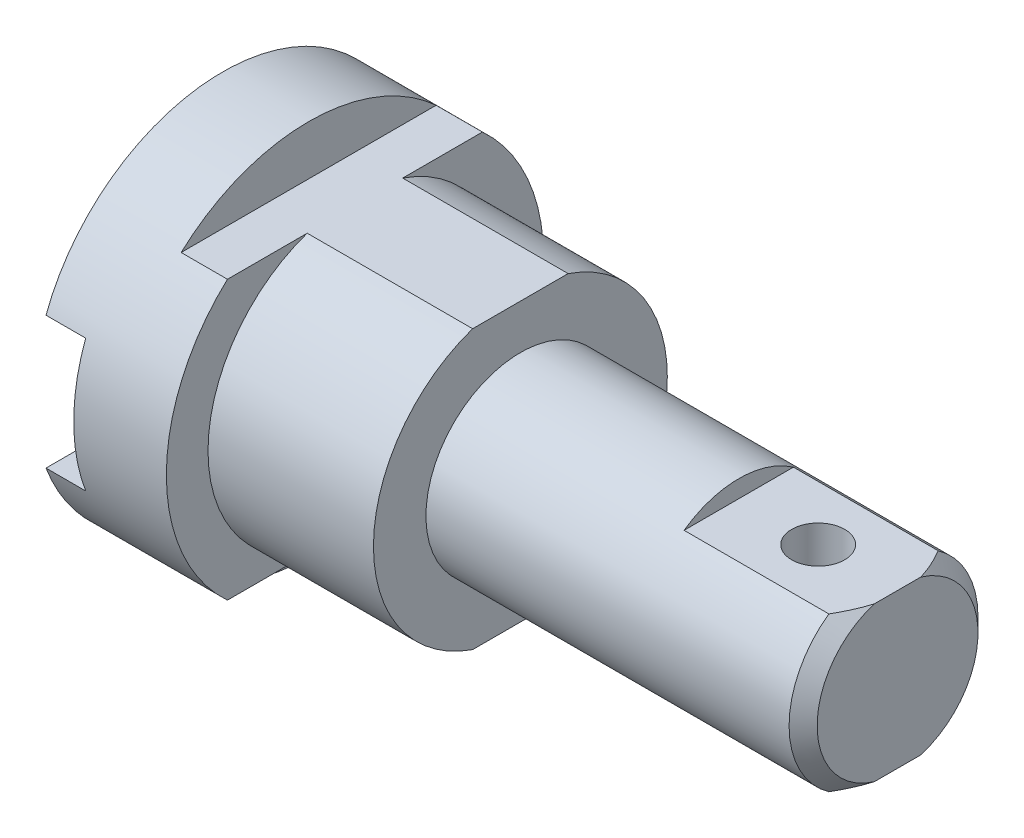
ISO-10303-21;
HEADER;
FILE_DESCRIPTION(('STEP AP214'),'2;1');
FILE_NAME('part.step','',(''),(''),'','','');
FILE_SCHEMA(('AUTOMOTIVE_DESIGN { 1 0 10303 214 1 1 1 1 }'));
ENDSEC;
DATA;
#1=APPLICATION_CONTEXT('core data for automotive mechanical design processes');
#2=APPLICATION_PROTOCOL_DEFINITION('international standard','automotive_design',2000,#1);
#3=PRODUCT_CONTEXT('',#1,'mechanical');
#4=PRODUCT('Part','Part','',(#3));
#5=PRODUCT_RELATED_PRODUCT_CATEGORY('part','',(#4));
#6=PRODUCT_DEFINITION_FORMATION('','',#4);
#7=PRODUCT_DEFINITION_CONTEXT('part definition',#1,'design');
#8=PRODUCT_DEFINITION('design','',#6,#7);
#9=PRODUCT_DEFINITION_SHAPE('','',#8);
#10=(LENGTH_UNIT() NAMED_UNIT(*) SI_UNIT(.MILLI.,.METRE.));
#11=(NAMED_UNIT(*) PLANE_ANGLE_UNIT() SI_UNIT($,.RADIAN.));
#12=(NAMED_UNIT(*) SI_UNIT($,.STERADIAN.) SOLID_ANGLE_UNIT());
#13=UNCERTAINTY_MEASURE_WITH_UNIT(LENGTH_MEASURE(1.E-05),#10,'distance_accuracy_value','');
#14=(GEOMETRIC_REPRESENTATION_CONTEXT(3) GLOBAL_UNCERTAINTY_ASSIGNED_CONTEXT((#13)) GLOBAL_UNIT_ASSIGNED_CONTEXT((#10,
#11,#12)) REPRESENTATION_CONTEXT('',''));
#15=CARTESIAN_POINT('',(0.,0.,0.));
#16=DIRECTION('',(0.,0.,1.));
#17=DIRECTION('',(1.,0.,0.));
#18=AXIS2_PLACEMENT_3D('',#15,#16,#17);
#19=CARTESIAN_POINT('',(0.,28.5,0.));
#20=DIRECTION('',(-1.,0.,0.));
#21=DIRECTION('',(0.,-1.,0.));
#22=AXIS2_PLACEMENT_3D('',#19,#20,#21);
#23=CYLINDRICAL_SURFACE('',#22,28.5);
#24=CARTESIAN_POINT('',(6.,28.5,0.));
#25=DIRECTION('',(-1.,0.,0.));
#26=DIRECTION('',(0.,0.,1.));
#27=AXIS2_PLACEMENT_3D('',#24,#25,#26);
#28=CIRCLE('',#27,28.5);
#29=CARTESIAN_POINT('',(6.,38.5,26.688012290165));
#30=VERTEX_POINT('',#29);
#31=CARTESIAN_POINT('',(6.,18.5,26.688012290165));
#32=VERTEX_POINT('',#31);
#33=EDGE_CURVE('E374',#30,#32,#28,.F.);
#34=ORIENTED_EDGE('',*,*,#33,.T.);
#35=DIRECTION('',(-1.,0.,0.));
#36=VECTOR('',#35,1.);
#37=CARTESIAN_POINT('',(0.,18.5,26.688012290165));
#38=LINE('',#37,#36);
#39=CARTESIAN_POINT('',(0.,18.5,26.688012290165));
#40=VERTEX_POINT('',#39);
#41=EDGE_CURVE('E389',#40,#32,#38,.F.);
#42=ORIENTED_EDGE('',*,*,#41,.F.);
#43=CARTESIAN_POINT('',(0.,28.5,0.));
#44=DIRECTION('',(-1.,0.,0.));
#45=DIRECTION('',(0.,-1.,0.));
#46=AXIS2_PLACEMENT_3D('',#43,#44,#45);
#47=CIRCLE('',#46,28.5);
#48=CARTESIAN_POINT('',(0.,18.5,-26.688012290165));
#49=VERTEX_POINT('',#48);
#50=EDGE_CURVE('E369',#49,#40,#47,.T.);
#51=ORIENTED_EDGE('',*,*,#50,.F.);
#52=DIRECTION('',(-1.,0.,0.));
#53=VECTOR('',#52,1.);
#54=CARTESIAN_POINT('',(0.,18.5,-26.688012290165));
#55=LINE('',#54,#53);
#56=CARTESIAN_POINT('',(6.,18.5,-26.688012290165));
#57=VERTEX_POINT('',#56);
#58=EDGE_CURVE('E386',#57,#49,#55,.T.);
#59=ORIENTED_EDGE('',*,*,#58,.F.);
#60=CARTESIAN_POINT('',(6.,38.5,-26.688012290165));
#61=VERTEX_POINT('',#60);
#62=EDGE_CURVE('E378',#57,#61,#28,.F.);
#63=ORIENTED_EDGE('',*,*,#62,.T.);
#64=DIRECTION('',(-1.,0.,0.));
#65=VECTOR('',#64,1.);
#66=CARTESIAN_POINT('',(0.,38.5,-26.688012290165));
#67=LINE('',#66,#65);
#68=CARTESIAN_POINT('',(0.,38.5,-26.688012290165));
#69=VERTEX_POINT('',#68);
#70=EDGE_CURVE('E382',#61,#69,#67,.T.);
#71=ORIENTED_EDGE('',*,*,#70,.T.);
#72=CARTESIAN_POINT('',(0.,38.5,26.688012290165));
#73=VERTEX_POINT('',#72);
#74=EDGE_CURVE('E373',#73,#69,#47,.T.);
#75=ORIENTED_EDGE('',*,*,#74,.F.);
#76=DIRECTION('',(-1.,0.,0.));
#77=VECTOR('',#76,1.);
#78=CARTESIAN_POINT('',(0.,38.5,26.688012290165));
#79=LINE('',#78,#77);
#80=EDGE_CURVE('E377',#73,#30,#79,.F.);
#81=ORIENTED_EDGE('',*,*,#80,.T.);
#82=EDGE_LOOP('',(#34,#42,#51,#59,#63,#71,#75,#81));
#83=FACE_BOUND('',#82,.T.);
#84=CARTESIAN_POINT('',(13.,28.5,0.));
#85=DIRECTION('',(1.,0.,0.));
#86=DIRECTION('',(0.,1.,0.));
#87=AXIS2_PLACEMENT_3D('',#84,#85,#86);
#88=CIRCLE('',#87,28.5);
#89=CARTESIAN_POINT('',(13.,7.49999999999999,19.2678488679977));
#90=VERTEX_POINT('',#89);
#91=CARTESIAN_POINT('',(13.,7.49999999999999,-19.2678488679977));
#92=VERTEX_POINT('',#91);
#93=EDGE_CURVE('E174',#90,#92,#88,.T.);
#94=ORIENTED_EDGE('',*,*,#93,.F.);
#95=DIRECTION('',(1.,0.,0.));
#96=VECTOR('',#95,1.);
#97=CARTESIAN_POINT('',(13.,7.49999999999999,19.2678488679977));
#98=LINE('',#97,#96);
#99=CARTESIAN_POINT('',(20.,7.49999999999999,19.2678488679977));
#100=VERTEX_POINT('',#99);
#101=EDGE_CURVE('E161',#90,#100,#98,.T.);
#102=ORIENTED_EDGE('',*,*,#101,.T.);
#103=CARTESIAN_POINT('',(20.,28.5,0.));
#104=DIRECTION('',(-1.,0.,0.));
#105=DIRECTION('',(0.,-1.,0.));
#106=AXIS2_PLACEMENT_3D('',#103,#104,#105);
#107=CIRCLE('',#106,28.5);
#108=CARTESIAN_POINT('',(20.,49.5,19.2678488679977));
#109=VERTEX_POINT('',#108);
#110=EDGE_CURVE('E366',#100,#109,#107,.T.);
#111=ORIENTED_EDGE('',*,*,#110,.T.);
#112=DIRECTION('',(-1.,0.,0.));
#113=VECTOR('',#112,1.);
#114=CARTESIAN_POINT('',(45.,49.5,19.2678488679977));
#115=LINE('',#114,#113);
#116=CARTESIAN_POINT('',(13.,49.5,19.2678488679977));
#117=VERTEX_POINT('',#116);
#118=EDGE_CURVE('E198',#109,#117,#115,.T.);
#119=ORIENTED_EDGE('',*,*,#118,.T.);
#120=CARTESIAN_POINT('',(13.,28.5,0.));
#121=DIRECTION('',(1.,0.,0.));
#122=DIRECTION('',(0.,1.,0.));
#123=AXIS2_PLACEMENT_3D('',#120,#121,#122);
#124=CIRCLE('',#123,28.5);
#125=CARTESIAN_POINT('',(13.,49.5,-19.2678488679977));
#126=VERTEX_POINT('',#125);
#127=EDGE_CURVE('E187',#126,#117,#124,.T.);
#128=ORIENTED_EDGE('',*,*,#127,.F.);
#129=DIRECTION('',(-1.,0.,0.));
#130=VECTOR('',#129,1.);
#131=CARTESIAN_POINT('',(45.,49.5,-19.2678488679977));
#132=LINE('',#131,#130);
#133=CARTESIAN_POINT('',(20.,49.5,-19.2678488679977));
#134=VERTEX_POINT('',#133);
#135=EDGE_CURVE('E195',#134,#126,#132,.T.);
#136=ORIENTED_EDGE('',*,*,#135,.F.);
#137=CARTESIAN_POINT('',(20.,7.49999999999999,-19.2678488679977));
#138=VERTEX_POINT('',#137);
#139=EDGE_CURVE('E365',#134,#138,#107,.T.);
#140=ORIENTED_EDGE('',*,*,#139,.T.);
#141=DIRECTION('',(1.,0.,0.));
#142=VECTOR('',#141,1.);
#143=CARTESIAN_POINT('',(13.,7.49999999999999,-19.2678488679977));
#144=LINE('',#143,#142);
#145=EDGE_CURVE('E173',#92,#138,#144,.T.);
#146=ORIENTED_EDGE('',*,*,#145,.F.);
#147=EDGE_LOOP('',(#94,#102,#111,#119,#128,#136,#140,#146));
#148=FACE_BOUND('',#147,.T.);
#149=ADVANCED_FACE('F38',(#83,#148),#23,.T.);
#150=CARTESIAN_POINT('',(20.,0.,0.));
#151=DIRECTION('',(1.,0.,0.));
#152=DIRECTION('',(0.,1.,0.));
#153=AXIS2_PLACEMENT_3D('',#150,#151,#152);
#154=PLANE('',#153);
#155=ORIENTED_EDGE('',*,*,#110,.F.);
#156=DIRECTION('',(0.,0.,-1.));
#157=VECTOR('',#156,1.);
#158=CARTESIAN_POINT('',(20.,7.49999999999999,0.));
#159=LINE('',#158,#157);
#160=CARTESIAN_POINT('',(20.,7.49999999999999,7.2154019292067));
#161=VERTEX_POINT('',#160);
#162=EDGE_CURVE('E167',#100,#161,#159,.T.);
#163=ORIENTED_EDGE('',*,*,#162,.T.);
#164=CARTESIAN_POINT('',(20.,28.5,0.));
#165=DIRECTION('',(-1.,0.,0.));
#166=DIRECTION('',(0.,-1.,0.));
#167=AXIS2_PLACEMENT_3D('',#164,#165,#166);
#168=CIRCLE('',#167,22.205);
#169=CARTESIAN_POINT('',(20.,49.5,7.21540192920668));
#170=VERTEX_POINT('',#169);
#171=EDGE_CURVE('E361',#161,#170,#168,.T.);
#172=ORIENTED_EDGE('',*,*,#171,.T.);
#173=DIRECTION('',(0.,0.,1.));
#174=VECTOR('',#173,1.);
#175=CARTESIAN_POINT('',(20.,49.5,0.));
#176=LINE('',#175,#174);
#177=EDGE_CURVE('E204',#170,#109,#176,.T.);
#178=ORIENTED_EDGE('',*,*,#177,.T.);
#179=EDGE_LOOP('',(#155,#163,#172,#178));
#180=FACE_BOUND('',#179,.T.);
#181=ADVANCED_FACE('F313',(#180),#154,.T.);
#182=CARTESIAN_POINT('',(20.,49.5,-7.21540192920668));
#183=VERTEX_POINT('',#182);
#184=CARTESIAN_POINT('',(20.,7.49999999999999,-7.2154019292067));
#185=VERTEX_POINT('',#184);
#186=EDGE_CURVE('E360',#183,#185,#168,.T.);
#187=ORIENTED_EDGE('',*,*,#186,.T.);
#188=EDGE_CURVE('E215',#185,#138,#159,.T.);
#189=ORIENTED_EDGE('',*,*,#188,.T.);
#190=ORIENTED_EDGE('',*,*,#139,.F.);
#191=EDGE_CURVE('E209',#134,#183,#176,.T.);
#192=ORIENTED_EDGE('',*,*,#191,.T.);
#193=EDGE_LOOP('',(#187,#189,#190,#192));
#194=FACE_BOUND('',#193,.T.);
#195=ADVANCED_FACE('F318',(#194),#154,.T.);
#196=CARTESIAN_POINT('',(0.,28.5,0.));
#197=DIRECTION('',(-1.,0.,0.));
#198=DIRECTION('',(0.,-1.,0.));
#199=AXIS2_PLACEMENT_3D('',#196,#197,#198);
#200=CYLINDRICAL_SURFACE('',#199,22.205);
#201=ORIENTED_EDGE('',*,*,#171,.F.);
#202=DIRECTION('',(-1.,0.,0.));
#203=VECTOR('',#202,1.);
#204=CARTESIAN_POINT('',(0.,7.49999999999999,7.2154019292067));
#205=LINE('',#204,#203);
#206=CARTESIAN_POINT('',(45.,7.49999999999999,7.21540192920669));
#207=VERTEX_POINT('',#206);
#208=EDGE_CURVE('E219',#161,#207,#205,.F.);
#209=ORIENTED_EDGE('',*,*,#208,.T.);
#210=CARTESIAN_POINT('',(45.,28.5,0.));
#211=DIRECTION('',(-1.,0.,0.));
#212=DIRECTION('',(0.,-1.,0.));
#213=AXIS2_PLACEMENT_3D('',#210,#211,#212);
#214=CIRCLE('',#213,22.205);
#215=CARTESIAN_POINT('',(45.,49.5,7.21540192920668));
#216=VERTEX_POINT('',#215);
#217=EDGE_CURVE('E352',#207,#216,#214,.T.);
#218=ORIENTED_EDGE('',*,*,#217,.T.);
#219=DIRECTION('',(-1.,0.,0.));
#220=VECTOR('',#219,1.);
#221=CARTESIAN_POINT('',(0.,49.5,7.21540192920668));
#222=LINE('',#221,#220);
#223=EDGE_CURVE('E61',#216,#170,#222,.T.);
#224=ORIENTED_EDGE('',*,*,#223,.T.);
#225=EDGE_LOOP('',(#201,#209,#218,#224));
#226=FACE_BOUND('',#225,.T.);
#227=ADVANCED_FACE('F322',(#226),#200,.T.);
#228=CARTESIAN_POINT('',(45.,49.5,-7.21540192920668));
#229=VERTEX_POINT('',#228);
#230=CARTESIAN_POINT('',(45.,7.49999999999999,-7.21540192920669));
#231=VERTEX_POINT('',#230);
#232=EDGE_CURVE('E345',#229,#231,#214,.T.);
#233=ORIENTED_EDGE('',*,*,#232,.T.);
#234=DIRECTION('',(-1.,0.,0.));
#235=VECTOR('',#234,1.);
#236=CARTESIAN_POINT('',(0.,7.49999999999999,-7.2154019292067));
#237=LINE('',#236,#235);
#238=EDGE_CURVE('E53',#231,#185,#237,.T.);
#239=ORIENTED_EDGE('',*,*,#238,.T.);
#240=ORIENTED_EDGE('',*,*,#186,.F.);
#241=DIRECTION('',(-1.,0.,0.));
#242=VECTOR('',#241,1.);
#243=CARTESIAN_POINT('',(0.,49.5,-7.21540192920668));
#244=LINE('',#243,#242);
#245=EDGE_CURVE('E208',#183,#229,#244,.F.);
#246=ORIENTED_EDGE('',*,*,#245,.T.);
#247=EDGE_LOOP('',(#233,#239,#240,#246));
#248=FACE_BOUND('',#247,.T.);
#249=ADVANCED_FACE('F325',(#248),#200,.T.);
#250=CARTESIAN_POINT('',(45.,0.,0.));
#251=DIRECTION('',(-1.,0.,0.));
#252=DIRECTION('',(0.,-1.,0.));
#253=AXIS2_PLACEMENT_3D('',#250,#251,#252);
#254=PLANE('',#253);
#255=CARTESIAN_POINT('',(45.,28.5,0.));
#256=DIRECTION('',(-1.,0.,0.));
#257=DIRECTION('',(0.,-1.,0.));
#258=AXIS2_PLACEMENT_3D('',#255,#256,#257);
#259=CIRCLE('',#258,14.275);
#260=CARTESIAN_POINT('',(45.,14.225,0.));
#261=VERTEX_POINT('',#260);
#262=EDGE_CURVE('E343',#261,#261,#259,.T.);
#263=ORIENTED_EDGE('',*,*,#262,.T.);
#264=EDGE_LOOP('',(#263));
#265=FACE_BOUND('',#264,.T.);
#266=DIRECTION('',(0.,0.,1.));
#267=VECTOR('',#266,1.);
#268=CARTESIAN_POINT('',(45.,7.49999999999999,0.));
#269=LINE('',#268,#267);
#270=EDGE_CURVE('E11',#231,#207,#269,.T.);
#271=ORIENTED_EDGE('',*,*,#270,.F.);
#272=ORIENTED_EDGE('',*,*,#232,.F.);
#273=DIRECTION('',(0.,0.,-1.));
#274=VECTOR('',#273,1.);
#275=CARTESIAN_POINT('',(45.,49.5,0.));
#276=LINE('',#275,#274);
#277=EDGE_CURVE('E47',#216,#229,#276,.T.);
#278=ORIENTED_EDGE('',*,*,#277,.F.);
#279=ORIENTED_EDGE('',*,*,#217,.F.);
#280=EDGE_LOOP('',(#271,#272,#278,#279));
#281=FACE_BOUND('',#280,.T.);
#282=ADVANCED_FACE('F327',(#265,#281),#254,.F.);
#283=CARTESIAN_POINT('',(0.,28.5,0.));
#284=DIRECTION('',(-1.,0.,0.));
#285=DIRECTION('',(0.,-1.,0.));
#286=AXIS2_PLACEMENT_3D('',#283,#284,#285);
#287=CYLINDRICAL_SURFACE('',#286,14.275);
#288=DIRECTION('',(1.,0.,0.));
#289=VECTOR('',#288,1.);
#290=CARTESIAN_POINT('',(78.,40.14,8.2635358654755));
#291=LINE('',#290,#289);
#292=CARTESIAN_POINT('',(78.,40.14,8.2635358654755));
#293=VERTEX_POINT('',#292);
#294=CARTESIAN_POINT('',(99.8786796564404,40.14,8.2635358654755));
#295=VERTEX_POINT('',#294);
#296=EDGE_CURVE('E242',#293,#295,#291,.T.);
#297=ORIENTED_EDGE('',*,*,#296,.F.);
#298=CARTESIAN_POINT('',(78.,28.5,0.));
#299=DIRECTION('',(1.,0.,0.));
#300=DIRECTION('',(0.,0.,-1.));
#301=AXIS2_PLACEMENT_3D('',#298,#299,#300);
#302=CIRCLE('',#301,14.275);
#303=CARTESIAN_POINT('',(78.,40.14,-8.2635358654755));
#304=VERTEX_POINT('',#303);
#305=EDGE_CURVE('E236',#304,#293,#302,.T.);
#306=ORIENTED_EDGE('',*,*,#305,.F.);
#307=DIRECTION('',(1.,0.,0.));
#308=VECTOR('',#307,1.);
#309=CARTESIAN_POINT('',(78.,40.14,-8.2635358654755));
#310=LINE('',#309,#308);
#311=CARTESIAN_POINT('',(99.8786796564404,40.14,-8.2635358654755));
#312=VERTEX_POINT('',#311);
#313=EDGE_CURVE('E241',#304,#312,#310,.T.);
#314=ORIENTED_EDGE('',*,*,#313,.T.);
#315=CARTESIAN_POINT('',(99.8786796564404,28.5,0.));
#316=DIRECTION('',(-1.,0.,0.));
#317=DIRECTION('',(0.,-1.,0.));
#318=AXIS2_PLACEMENT_3D('',#315,#316,#317);
#319=CIRCLE('',#318,14.275);
#320=CARTESIAN_POINT('',(99.8786796564404,16.86,-8.2635358654755));
#321=VERTEX_POINT('',#320);
#322=EDGE_CURVE('E354',#312,#321,#319,.T.);
#323=ORIENTED_EDGE('',*,*,#322,.T.);
#324=DIRECTION('',(1.,0.,0.));
#325=VECTOR('',#324,1.);
#326=CARTESIAN_POINT('',(78.,16.86,-8.2635358654755));
#327=LINE('',#326,#325);
#328=CARTESIAN_POINT('',(78.,16.86,-8.2635358654755));
#329=VERTEX_POINT('',#328);
#330=EDGE_CURVE('E237',#329,#321,#327,.T.);
#331=ORIENTED_EDGE('',*,*,#330,.F.);
#332=CARTESIAN_POINT('',(78.,28.5,0.));
#333=DIRECTION('',(1.,0.,0.));
#334=DIRECTION('',(0.,0.,-1.));
#335=AXIS2_PLACEMENT_3D('',#332,#333,#334);
#336=CIRCLE('',#335,14.275);
#337=CARTESIAN_POINT('',(78.,16.86,8.2635358654755));
#338=VERTEX_POINT('',#337);
#339=EDGE_CURVE('E251',#338,#329,#336,.T.);
#340=ORIENTED_EDGE('',*,*,#339,.F.);
#341=DIRECTION('',(1.,0.,0.));
#342=VECTOR('',#341,1.);
#343=CARTESIAN_POINT('',(78.,16.86,8.2635358654755));
#344=LINE('',#343,#342);
#345=CARTESIAN_POINT('',(99.8786796564404,16.86,8.2635358654755));
#346=VERTEX_POINT('',#345);
#347=EDGE_CURVE('E255',#338,#346,#344,.T.);
#348=ORIENTED_EDGE('',*,*,#347,.T.);
#349=EDGE_CURVE('E346',#346,#295,#319,.T.);
#350=ORIENTED_EDGE('',*,*,#349,.T.);
#351=EDGE_LOOP('',(#297,#306,#314,#323,#331,#340,#348,#350));
#352=FACE_BOUND('',#351,.T.);
#353=ORIENTED_EDGE('',*,*,#262,.F.);
#354=EDGE_LOOP('',(#353));
#355=FACE_BOUND('',#354,.T.);
#356=ADVANCED_FACE('F329',(#352,#355),#287,.T.);
#357=CARTESIAN_POINT('',(99.8786796564404,28.5,0.));
#358=DIRECTION('',(-1.,0.,0.));
#359=DIRECTION('',(0.,-1.,0.));
#360=AXIS2_PLACEMENT_3D('',#357,#358,#359);
#361=CONICAL_SURFACE('',#360,14.275,0.785398163397454);
#362=CARTESIAN_POINT('',(92.498062588906,40.14,18.2613293759159));
#363=CARTESIAN_POINT('',(92.7363226574536,40.14,17.9787688709205));
#364=CARTESIAN_POINT('',(92.9736643875376,40.14,17.6954304428129));
#365=CARTESIAN_POINT('',(93.446236530121,40.14,17.1269872047509));
#366=CARTESIAN_POINT('',(93.6814668910517,40.14,16.841882351939));
#367=CARTESIAN_POINT('',(94.1496747980146,40.14,16.2695324940389));
#368=CARTESIAN_POINT('',(94.382650860377,40.14,15.9822862741076));
#369=CARTESIAN_POINT('',(94.8458532936076,40.14,15.4055859145328));
#370=CARTESIAN_POINT('',(95.0760796775637,40.14,15.1161317854091));
#371=CARTESIAN_POINT('',(95.5421829378795,40.14,14.5235318144026));
#372=CARTESIAN_POINT('',(95.7779356581344,40.14,14.220288203307));
#373=CARTESIAN_POINT('',(96.2454689034429,40.14,13.6107551187639));
#374=CARTESIAN_POINT('',(96.4772494683969,40.14,13.3044656759607));
#375=CARTESIAN_POINT('',(96.9360953159255,40.14,12.6884920225647));
#376=CARTESIAN_POINT('',(97.1631617966741,40.14,12.3788087059366));
#377=CARTESIAN_POINT('',(97.611794154481,40.14,11.7554755223952));
#378=CARTESIAN_POINT('',(97.8333600332159,40.14,11.441825656691));
#379=CARTESIAN_POINT('',(98.2705743023471,40.14,10.8090660285851));
#380=CARTESIAN_POINT('',(98.4862035698018,40.14,10.489943020389));
#381=CARTESIAN_POINT('',(98.9095422664797,40.14,9.84646393188221));
#382=CARTESIAN_POINT('',(99.1172515810786,40.14,9.5221077759296));
#383=CARTESIAN_POINT('',(99.5232866514261,40.14,8.86707037649804));
#384=CARTESIAN_POINT('',(99.7216021131482,40.14,8.53638272747245));
#385=CARTESIAN_POINT('',(100.106480455398,40.14,7.86821430755542));
#386=CARTESIAN_POINT('',(100.293043621564,40.14,7.53073370202946));
#387=CARTESIAN_POINT('',(100.648904358937,40.14,6.85354099477498));
#388=CARTESIAN_POINT('',(100.818428292339,40.14,6.51394855756123));
#389=CARTESIAN_POINT('',(101.140342545527,40.14,5.82662333486554));
#390=CARTESIAN_POINT('',(101.292730725293,40.14,5.4788895391778));
#391=CARTESIAN_POINT('',(101.576210550916,40.14,4.77560766208542));
#392=CARTESIAN_POINT('',(101.707345993088,40.14,4.42007741003604));
#393=CARTESIAN_POINT('',(101.944256931558,40.14,3.70075525567693));
#394=CARTESIAN_POINT('',(102.050044668793,40.14,3.33696743441941));
#395=CARTESIAN_POINT('',(102.232892722163,40.14,2.5972103251297));
#396=CARTESIAN_POINT('',(102.3095703756,40.14,2.22114493668793));
#397=CARTESIAN_POINT('',(102.427998182631,40.14,1.46350379375055));
#398=CARTESIAN_POINT('',(102.469752655395,40.14,1.08192872661143));
#399=CARTESIAN_POINT('',(102.515583194606,40.14,0.317492505654497));
#400=CARTESIAN_POINT('',(102.519758659882,40.14,-0.0653625741706913));
#401=CARTESIAN_POINT('',(102.490403289775,40.14,-0.829626247042338));
#402=CARTESIAN_POINT('',(102.456869521945,40.14,-1.21103472527989));
#403=CARTESIAN_POINT('',(102.354899438839,40.14,-1.96455681975909));
#404=CARTESIAN_POINT('',(102.286872824525,40.14,-2.33672693803497));
#405=CARTESIAN_POINT('',(102.119974529391,40.14,-3.07400978974065));
#406=CARTESIAN_POINT('',(102.021099619263,40.14,-3.43912178004956));
#407=CARTESIAN_POINT('',(101.795608186654,40.14,-4.1657209635291));
#408=CARTESIAN_POINT('',(101.668652834269,40.14,-4.5271019717973));
#409=CARTESIAN_POINT('',(101.461486502576,40.14,-5.0625334185967));
#410=CARTESIAN_POINT('',(101.389646908886,40.14,-5.23989361715499));
#411=CARTESIAN_POINT('',(101.240899878285,40.14,-5.59247922915801));
#412=CARTESIAN_POINT('',(101.16399244919,40.14,-5.76770464589473));
#413=CARTESIAN_POINT('',(100.95003398459,40.14,-6.23830112012855));
#414=CARTESIAN_POINT('',(100.808646808563,40.14,-6.53170372976619));
#415=CARTESIAN_POINT('',(100.514754627782,40.14,-7.11291362228487));
#416=CARTESIAN_POINT('',(100.362247592532,40.14,-7.40071987105071));
#417=CARTESIAN_POINT('',(100.047799719642,40.14,-7.97138528379952));
#418=CARTESIAN_POINT('',(99.8858521568052,40.14,-8.25424072974745));
#419=CARTESIAN_POINT('',(99.5541082685837,40.14,-8.81527357299191));
#420=CARTESIAN_POINT('',(99.3843123718802,40.14,-9.09345122466373));
#421=CARTESIAN_POINT('',(99.0373191587926,40.14,-9.64683495353779));
#422=CARTESIAN_POINT('',(98.8600927624737,40.14,-9.92202275243069));
#423=CARTESIAN_POINT('',(98.4999302631763,40.14,-10.4686423487819));
#424=CARTESIAN_POINT('',(98.3169939136422,40.14,-10.7400739833168));
#425=CARTESIAN_POINT('',(97.7610488148776,40.14,-11.5491447780401));
#426=CARTESIAN_POINT('',(97.3807603551287,40.14,-12.0817859176852));
#427=CARTESIAN_POINT('',(96.6350558764365,40.14,-13.0966238045673));
#428=CARTESIAN_POINT('',(96.2706835243844,40.14,-13.5795937633639));
#429=CARTESIAN_POINT('',(95.5323194344877,40.14,-14.5381876723539));
#430=CARTESIAN_POINT('',(95.158326730677,40.14,-15.0138108771357));
#431=CARTESIAN_POINT('',(94.4065766957165,40.14,-15.9542290592023));
#432=CARTESIAN_POINT('',(94.0288952545336,40.14,-16.4190848523365));
#433=CARTESIAN_POINT('',(93.4579312996867,40.14,-17.112614089158));
#434=CARTESIAN_POINT('',(93.2668912213765,40.14,-17.343139276386));
#435=CARTESIAN_POINT('',(92.8834577739718,40.14,-17.803057088421));
#436=CARTESIAN_POINT('',(92.6910644206832,40.14,-18.0324497264028));
#437=CARTESIAN_POINT('',(92.498062588906,40.14,-18.2613293759159));
#438=B_SPLINE_CURVE_WITH_KNOTS('',3,(#362,#363,#364,#365,#366,#367,#368,#369,#370,#371,#372,
#373,#374,#375,#376,#377,#378,#379,#380,#381,#382,#383,#384,#385,#386,#387,#388,#389,#390,#391,
#392,#393,#394,#395,#396,#397,#398,#399,#400,#401,#402,#403,#404,#405,#406,#407,#408,#409,#410,
#411,#412,#413,#414,#415,#416,#417,#418,#419,#420,#421,#422,#423,#424,#425,#426,#427,#428,#429,
#430,#431,#432,#433,#434,#435,#436,#437),.UNSPECIFIED.,.F.,.F.,(4,2,2,2,2,2,2,2,2,2,2,2,2,2,2,2,
2,2,2,2,2,2,2,2,2,2,2,2,2,2,2,2,2,2,2,2,2,4),(0.,1.10881888056787,2.21766476990554,
3.32719661919789,4.43672318525666,5.58900756217082,6.741280357564,7.89325660385452,
9.04523249899666,10.2005649285804,11.3559140727591,12.5125012992672,13.6690604041706,
14.8073316902308,15.9457449731299,17.081781605823,18.2172685118476,19.3672036401299,
20.5169965276411,21.6637472441805,22.8105871435641,23.9441134434619,25.077758444684,
26.2259112658393,26.7999199186456,27.3739276861793,28.3507013996655,29.3276539217719,
30.3053111133121,31.2829149674579,32.2647873667701,33.2467022220978,35.2097288488291,
37.0246024832824,38.8396590634923,40.6364291119551,41.5346139531582,42.432788321194),.UNSPECIFIED.);
#439=CARTESIAN_POINT('',(102.,40.14,3.49604479252941));
#440=VERTEX_POINT('',#439);
#441=EDGE_CURVE('E462',#295,#440,#438,.T.);
#442=ORIENTED_EDGE('',*,*,#441,.F.);
#443=ORIENTED_EDGE('',*,*,#349,.F.);
#444=CARTESIAN_POINT('',(92.498062588906,16.86,18.2613293759159));
#445=CARTESIAN_POINT('',(92.7363226574536,16.86,17.9787688709205));
#446=CARTESIAN_POINT('',(92.9736643875377,16.86,17.6954304428129));
#447=CARTESIAN_POINT('',(93.446236530121,16.86,17.1269872047509));
#448=CARTESIAN_POINT('',(93.6814668910517,16.86,16.841882351939));
#449=CARTESIAN_POINT('',(94.1496747980146,16.86,16.2695324940389));
#450=CARTESIAN_POINT('',(94.382650860377,16.86,15.9822862741076));
#451=CARTESIAN_POINT('',(94.8458532936076,16.86,15.4055859145328));
#452=CARTESIAN_POINT('',(95.0760796775637,16.86,15.1161317854091));
#453=CARTESIAN_POINT('',(95.5421829378795,16.86,14.5235318144026));
#454=CARTESIAN_POINT('',(95.7779356581344,16.86,14.220288203307));
#455=CARTESIAN_POINT('',(96.2454689034429,16.86,13.6107551187639));
#456=CARTESIAN_POINT('',(96.4772494683969,16.86,13.3044656759607));
#457=CARTESIAN_POINT('',(96.9360953159255,16.86,12.6884920225647));
#458=CARTESIAN_POINT('',(97.1631617966741,16.86,12.3788087059366));
#459=CARTESIAN_POINT('',(97.611794154481,16.86,11.7554755223952));
#460=CARTESIAN_POINT('',(97.8333600332159,16.86,11.441825656691));
#461=CARTESIAN_POINT('',(98.2705743023471,16.86,10.8090660285851));
#462=CARTESIAN_POINT('',(98.4862035698018,16.86,10.489943020389));
#463=CARTESIAN_POINT('',(98.9095422664797,16.86,9.8464639318822));
#464=CARTESIAN_POINT('',(99.1172515810786,16.86,9.52210777592959));
#465=CARTESIAN_POINT('',(99.5232866514261,16.86,8.86707037649803));
#466=CARTESIAN_POINT('',(99.7216021131482,16.86,8.53638272747244));
#467=CARTESIAN_POINT('',(100.106480455398,16.86,7.86821430755541));
#468=CARTESIAN_POINT('',(100.293043621564,16.86,7.53073370202945));
#469=CARTESIAN_POINT('',(100.648904358937,16.86,6.85354099477497));
#470=CARTESIAN_POINT('',(100.818428292339,16.86,6.51394855756122));
#471=CARTESIAN_POINT('',(101.140342545527,16.86,5.82662333486553));
#472=CARTESIAN_POINT('',(101.292730725293,16.86,5.47888953917779));
#473=CARTESIAN_POINT('',(101.576210550916,16.86,4.77560766208541));
#474=CARTESIAN_POINT('',(101.707345993088,16.86,4.42007741003602));
#475=CARTESIAN_POINT('',(101.944256931558,16.86,3.70075525567692));
#476=CARTESIAN_POINT('',(102.050044668793,16.86,3.33696743441939));
#477=CARTESIAN_POINT('',(102.232892722163,16.86,2.59721032512969));
#478=CARTESIAN_POINT('',(102.3095703756,16.86,2.22114493668792));
#479=CARTESIAN_POINT('',(102.427998182631,16.86,1.46350379375054));
#480=CARTESIAN_POINT('',(102.469752655395,16.86,1.08192872661142));
#481=CARTESIAN_POINT('',(102.515583194606,16.86,0.317492505654482));
#482=CARTESIAN_POINT('',(102.519758659882,16.86,-0.0653625741707067));
#483=CARTESIAN_POINT('',(102.490403289775,16.86,-0.829626247042354));
#484=CARTESIAN_POINT('',(102.456869521945,16.86,-1.21103472527991));
#485=CARTESIAN_POINT('',(102.354899438839,16.86,-1.96455681975911));
#486=CARTESIAN_POINT('',(102.286872824525,16.86,-2.33672693803498));
#487=CARTESIAN_POINT('',(102.119974529391,16.86,-3.07400978974067));
#488=CARTESIAN_POINT('',(102.021099619263,16.86,-3.43912178004957));
#489=CARTESIAN_POINT('',(101.795608186654,16.86,-4.16572096352912));
#490=CARTESIAN_POINT('',(101.668652834269,16.86,-4.52710197179731));
#491=CARTESIAN_POINT('',(101.461486502576,16.86,-5.06253341859671));
#492=CARTESIAN_POINT('',(101.389646908886,16.86,-5.239893617155));
#493=CARTESIAN_POINT('',(101.240899878285,16.86,-5.59247922915802));
#494=CARTESIAN_POINT('',(101.16399244919,16.86,-5.76770464589474));
#495=CARTESIAN_POINT('',(100.95003398459,16.86,-6.23830112012856));
#496=CARTESIAN_POINT('',(100.808646808563,16.86,-6.5317037297662));
#497=CARTESIAN_POINT('',(100.514754627782,16.86,-7.11291362228488));
#498=CARTESIAN_POINT('',(100.362247592532,16.86,-7.40071987105072));
#499=CARTESIAN_POINT('',(100.047799719642,16.86,-7.97138528379952));
#500=CARTESIAN_POINT('',(99.8858521568052,16.86,-8.25424072974745));
#501=CARTESIAN_POINT('',(99.5541082685837,16.86,-8.81527357299191));
#502=CARTESIAN_POINT('',(99.3843123718802,16.86,-9.09345122466374));
#503=CARTESIAN_POINT('',(99.0373191587926,16.86,-9.6468349535378));
#504=CARTESIAN_POINT('',(98.8600927624737,16.86,-9.92202275243069));
#505=CARTESIAN_POINT('',(98.4999302631763,16.86,-10.4686423487819));
#506=CARTESIAN_POINT('',(98.3169939136422,16.86,-10.7400739833168));
#507=CARTESIAN_POINT('',(97.7610488148776,16.86,-11.5491447780401));
#508=CARTESIAN_POINT('',(97.3807603551287,16.86,-12.0817859176852));
#509=CARTESIAN_POINT('',(96.6350558764365,16.86,-13.0966238045673));
#510=CARTESIAN_POINT('',(96.2706835243844,16.86,-13.5795937633639));
#511=CARTESIAN_POINT('',(95.5323194344877,16.86,-14.5381876723539));
#512=CARTESIAN_POINT('',(95.158326730677,16.86,-15.0138108771357));
#513=CARTESIAN_POINT('',(94.4065766957165,16.86,-15.9542290592023));
#514=CARTESIAN_POINT('',(94.0288952545336,16.86,-16.4190848523365));
#515=CARTESIAN_POINT('',(93.4579312996867,16.86,-17.112614089158));
#516=CARTESIAN_POINT('',(93.2668912213765,16.86,-17.343139276386));
#517=CARTESIAN_POINT('',(92.8834577739718,16.86,-17.803057088421));
#518=CARTESIAN_POINT('',(92.6910644206832,16.86,-18.0324497264028));
#519=CARTESIAN_POINT('',(92.498062588906,16.86,-18.2613293759159));
#520=B_SPLINE_CURVE_WITH_KNOTS('',3,(#444,#445,#446,#447,#448,#449,#450,#451,#452,#453,#454,
#455,#456,#457,#458,#459,#460,#461,#462,#463,#464,#465,#466,#467,#468,#469,#470,#471,#472,#473,
#474,#475,#476,#477,#478,#479,#480,#481,#482,#483,#484,#485,#486,#487,#488,#489,#490,#491,#492,
#493,#494,#495,#496,#497,#498,#499,#500,#501,#502,#503,#504,#505,#506,#507,#508,#509,#510,#511,
#512,#513,#514,#515,#516,#517,#518,#519),.UNSPECIFIED.,.F.,.F.,(4,2,2,2,2,2,2,2,2,2,2,2,2,2,2,2,
2,2,2,2,2,2,2,2,2,2,2,2,2,2,2,2,2,2,2,2,2,4),(0.,1.10881888056787,2.21766476990552,
3.32719661919786,4.43672318525665,5.58900756217082,6.74128035756399,7.89325660385453,
9.04523249899666,10.2005649285804,11.3559140727591,12.5125012992672,13.6690604041706,
14.8073316902308,15.9457449731299,17.081781605823,18.2172685118476,19.3672036401299,
20.5169965276411,21.6637472441805,22.8105871435641,23.944113443462,25.077758444684,
26.2259112658393,26.7999199186456,27.3739276861793,28.3507013996655,29.3276539217719,
30.3053111133121,31.2829149674579,32.2647873667701,33.2467022220978,35.2097288488291,
37.0246024832824,38.8396590634922,40.6364291119551,41.5346139531582,42.432788321194),.UNSPECIFIED.);
#521=CARTESIAN_POINT('',(102.,16.86,3.49604479252941));
#522=VERTEX_POINT('',#521);
#523=EDGE_CURVE('E270',#346,#522,#520,.T.);
#524=ORIENTED_EDGE('',*,*,#523,.T.);
#525=CARTESIAN_POINT('',(102.,28.5,0.));
#526=DIRECTION('',(-1.,0.,0.));
#527=DIRECTION('',(0.,-1.,0.));
#528=AXIS2_PLACEMENT_3D('',#525,#526,#527);
#529=CIRCLE('',#528,12.1536796564404);
#530=EDGE_CURVE('E470',#522,#440,#529,.T.);
#531=ORIENTED_EDGE('',*,*,#530,.T.);
#532=EDGE_LOOP('',(#442,#443,#524,#531));
#533=FACE_BOUND('',#532,.T.);
#534=ADVANCED_FACE('F278',(#533),#361,.T.);
#535=CARTESIAN_POINT('',(102.,40.14,-3.49604479252941));
#536=VERTEX_POINT('',#535);
#537=EDGE_CURVE('E271',#536,#312,#438,.T.);
#538=ORIENTED_EDGE('',*,*,#537,.F.);
#539=CARTESIAN_POINT('',(102.,16.86,-3.49604479252941));
#540=VERTEX_POINT('',#539);
#541=EDGE_CURVE('E472',#536,#540,#529,.T.);
#542=ORIENTED_EDGE('',*,*,#541,.T.);
#543=EDGE_CURVE('E245',#540,#321,#520,.T.);
#544=ORIENTED_EDGE('',*,*,#543,.T.);
#545=ORIENTED_EDGE('',*,*,#322,.F.);
#546=EDGE_LOOP('',(#538,#542,#544,#545));
#547=FACE_BOUND('',#546,.T.);
#548=ADVANCED_FACE('F303',(#547),#361,.T.);
#549=CARTESIAN_POINT('',(102.,0.,0.));
#550=DIRECTION('',(-1.,0.,0.));
#551=DIRECTION('',(0.,-1.,0.));
#552=AXIS2_PLACEMENT_3D('',#549,#550,#551);
#553=PLANE('',#552);
#554=ORIENTED_EDGE('',*,*,#541,.F.);
#555=DIRECTION('',(0.,0.,1.));
#556=VECTOR('',#555,1.);
#557=CARTESIAN_POINT('',(102.,40.14,0.));
#558=LINE('',#557,#556);
#559=EDGE_CURVE('E396',#536,#440,#558,.T.);
#560=ORIENTED_EDGE('',*,*,#559,.T.);
#561=ORIENTED_EDGE('',*,*,#530,.F.);
#562=DIRECTION('',(0.,0.,1.));
#563=VECTOR('',#562,1.);
#564=CARTESIAN_POINT('',(102.,16.86,0.));
#565=LINE('',#564,#563);
#566=EDGE_CURVE('E393',#540,#522,#565,.T.);
#567=ORIENTED_EDGE('',*,*,#566,.F.);
#568=EDGE_LOOP('',(#554,#560,#561,#567));
#569=FACE_BOUND('',#568,.T.);
#570=ADVANCED_FACE('F300',(#569),#553,.F.);
#571=CARTESIAN_POINT('',(0.,0.,0.));
#572=DIRECTION('',(1.,0.,0.));
#573=DIRECTION('',(0.,1.,0.));
#574=AXIS2_PLACEMENT_3D('',#571,#572,#573);
#575=PLANE('',#574);
#576=DIRECTION('',(0.,0.,1.));
#577=VECTOR('',#576,1.);
#578=CARTESIAN_POINT('',(0.,38.5,-28.5));
#579=LINE('',#578,#577);
#580=EDGE_CURVE('E484',#69,#73,#579,.T.);
#581=ORIENTED_EDGE('',*,*,#580,.T.);
#582=ORIENTED_EDGE('',*,*,#74,.T.);
#583=EDGE_LOOP('',(#581,#582));
#584=FACE_BOUND('',#583,.T.);
#585=ADVANCED_FACE('F302',(#584),#575,.F.);
#586=ORIENTED_EDGE('',*,*,#50,.T.);
#587=DIRECTION('',(0.,0.,1.));
#588=VECTOR('',#587,1.);
#589=CARTESIAN_POINT('',(0.,18.5,-28.5));
#590=LINE('',#589,#588);
#591=EDGE_CURVE('E488',#49,#40,#590,.T.);
#592=ORIENTED_EDGE('',*,*,#591,.F.);
#593=EDGE_LOOP('',(#586,#592));
#594=FACE_BOUND('',#593,.T.);
#595=ADVANCED_FACE('F40',(#594),#575,.F.);
#596=CARTESIAN_POINT('',(6.,0.,-28.5));
#597=DIRECTION('',(-1.,0.,0.));
#598=DIRECTION('',(0.,0.,1.));
#599=AXIS2_PLACEMENT_3D('',#596,#597,#598);
#600=PLANE('',#599);
#601=DIRECTION('',(0.,0.,1.));
#602=VECTOR('',#601,1.);
#603=CARTESIAN_POINT('',(6.,18.5,-28.5));
#604=LINE('',#603,#602);
#605=EDGE_CURVE('E479',#57,#32,#604,.T.);
#606=ORIENTED_EDGE('',*,*,#605,.T.);
#607=ORIENTED_EDGE('',*,*,#33,.F.);
#608=DIRECTION('',(0.,0.,1.));
#609=VECTOR('',#608,1.);
#610=CARTESIAN_POINT('',(6.,38.5,-28.5));
#611=LINE('',#610,#609);
#612=EDGE_CURVE('E467',#61,#30,#611,.T.);
#613=ORIENTED_EDGE('',*,*,#612,.F.);
#614=ORIENTED_EDGE('',*,*,#62,.F.);
#615=EDGE_LOOP('',(#606,#607,#613,#614));
#616=FACE_BOUND('',#615,.T.);
#617=ADVANCED_FACE('F293',(#616),#600,.T.);
#618=CARTESIAN_POINT('',(0.,18.5,-28.5));
#619=DIRECTION('',(0.,-1.,0.));
#620=DIRECTION('',(1.,0.,0.));
#621=AXIS2_PLACEMENT_3D('',#618,#619,#620);
#622=PLANE('',#621);
#623=ORIENTED_EDGE('',*,*,#41,.T.);
#624=ORIENTED_EDGE('',*,*,#605,.F.);
#625=ORIENTED_EDGE('',*,*,#58,.T.);
#626=ORIENTED_EDGE('',*,*,#591,.T.);
#627=EDGE_LOOP('',(#623,#624,#625,#626));
#628=FACE_BOUND('',#627,.T.);
#629=ADVANCED_FACE('F290',(#628),#622,.F.);
#630=CARTESIAN_POINT('',(0.,38.5,-28.5));
#631=DIRECTION('',(0.,-1.,0.));
#632=DIRECTION('',(1.,0.,0.));
#633=AXIS2_PLACEMENT_3D('',#630,#631,#632);
#634=PLANE('',#633);
#635=ORIENTED_EDGE('',*,*,#580,.F.);
#636=ORIENTED_EDGE('',*,*,#70,.F.);
#637=ORIENTED_EDGE('',*,*,#612,.T.);
#638=ORIENTED_EDGE('',*,*,#80,.F.);
#639=EDGE_LOOP('',(#635,#636,#637,#638));
#640=FACE_BOUND('',#639,.T.);
#641=ADVANCED_FACE('F288',(#640),#634,.T.);
#642=CARTESIAN_POINT('',(78.,16.86,0.));
#643=DIRECTION('',(0.,-1.,0.));
#644=DIRECTION('',(1.,0.,0.));
#645=AXIS2_PLACEMENT_3D('',#642,#643,#644);
#646=PLANE('',#645);
#647=CARTESIAN_POINT('',(90.,16.86,0.));
#648=DIRECTION('',(0.,-1.,0.));
#649=DIRECTION('',(1.,0.,0.));
#650=AXIS2_PLACEMENT_3D('',#647,#648,#649);
#651=CIRCLE('',#650,4.00000000000001);
#652=CARTESIAN_POINT('',(94.,16.86,0.));
#653=VERTEX_POINT('',#652);
#654=EDGE_CURVE('E227',#653,#653,#651,.T.);
#655=ORIENTED_EDGE('',*,*,#654,.F.);
#656=EDGE_LOOP('',(#655));
#657=FACE_BOUND('',#656,.T.);
#658=ORIENTED_EDGE('',*,*,#347,.F.);
#659=DIRECTION('',(0.,0.,-1.));
#660=VECTOR('',#659,1.);
#661=CARTESIAN_POINT('',(78.,16.86,0.));
#662=LINE('',#661,#660);
#663=EDGE_CURVE('E231',#338,#329,#662,.T.);
#664=ORIENTED_EDGE('',*,*,#663,.T.);
#665=ORIENTED_EDGE('',*,*,#330,.T.);
#666=ORIENTED_EDGE('',*,*,#543,.F.);
#667=ORIENTED_EDGE('',*,*,#566,.T.);
#668=ORIENTED_EDGE('',*,*,#523,.F.);
#669=EDGE_LOOP('',(#658,#664,#665,#666,#667,#668));
#670=FACE_BOUND('',#669,.T.);
#671=ADVANCED_FACE('F282',(#657,#670),#646,.T.);
#672=CARTESIAN_POINT('',(78.,0.,0.));
#673=DIRECTION('',(1.,0.,0.));
#674=DIRECTION('',(0.,0.,-1.));
#675=AXIS2_PLACEMENT_3D('',#672,#673,#674);
#676=PLANE('',#675);
#677=ORIENTED_EDGE('',*,*,#663,.F.);
#678=ORIENTED_EDGE('',*,*,#339,.T.);
#679=EDGE_LOOP('',(#677,#678));
#680=FACE_BOUND('',#679,.T.);
#681=ADVANCED_FACE('F287',(#680),#676,.T.);
#682=CARTESIAN_POINT('',(78.,40.14,0.));
#683=DIRECTION('',(0.,-1.,0.));
#684=DIRECTION('',(1.,0.,0.));
#685=AXIS2_PLACEMENT_3D('',#682,#683,#684);
#686=PLANE('',#685);
#687=CARTESIAN_POINT('',(90.,40.14,0.));
#688=DIRECTION('',(0.,1.,0.));
#689=DIRECTION('',(-1.,0.,0.));
#690=AXIS2_PLACEMENT_3D('',#687,#688,#689);
#691=CIRCLE('',#690,4.00000000000001);
#692=CARTESIAN_POINT('',(86.,40.14,0.));
#693=VERTEX_POINT('',#692);
#694=EDGE_CURVE('E223',#693,#693,#691,.T.);
#695=ORIENTED_EDGE('',*,*,#694,.F.);
#696=EDGE_LOOP('',(#695));
#697=FACE_BOUND('',#696,.T.);
#698=ORIENTED_EDGE('',*,*,#441,.T.);
#699=ORIENTED_EDGE('',*,*,#559,.F.);
#700=ORIENTED_EDGE('',*,*,#537,.T.);
#701=ORIENTED_EDGE('',*,*,#313,.F.);
#702=DIRECTION('',(0.,0.,-1.));
#703=VECTOR('',#702,1.);
#704=CARTESIAN_POINT('',(78.,40.14,0.));
#705=LINE('',#704,#703);
#706=EDGE_CURVE('E232',#293,#304,#705,.T.);
#707=ORIENTED_EDGE('',*,*,#706,.F.);
#708=ORIENTED_EDGE('',*,*,#296,.T.);
#709=EDGE_LOOP('',(#698,#699,#700,#701,#707,#708));
#710=FACE_BOUND('',#709,.T.);
#711=ADVANCED_FACE('F450',(#697,#710),#686,.F.);
#712=CARTESIAN_POINT('',(78.,0.,0.));
#713=DIRECTION('',(1.,0.,0.));
#714=DIRECTION('',(0.,0.,-1.));
#715=AXIS2_PLACEMENT_3D('',#712,#713,#714);
#716=PLANE('',#715);
#717=ORIENTED_EDGE('',*,*,#706,.T.);
#718=ORIENTED_EDGE('',*,*,#305,.T.);
#719=EDGE_LOOP('',(#717,#718));
#720=FACE_BOUND('',#719,.T.);
#721=ADVANCED_FACE('F447',(#720),#716,.T.);
#722=CARTESIAN_POINT('',(90.,0.,0.));
#723=DIRECTION('',(0.,1.,0.));
#724=DIRECTION('',(-1.,0.,0.));
#725=AXIS2_PLACEMENT_3D('',#722,#723,#724);
#726=CYLINDRICAL_SURFACE('',#725,4.00000000000001);
#727=ORIENTED_EDGE('',*,*,#654,.T.);
#728=EDGE_LOOP('',(#727));
#729=FACE_BOUND('',#728,.T.);
#730=ORIENTED_EDGE('',*,*,#694,.T.);
#731=EDGE_LOOP('',(#730));
#732=FACE_BOUND('',#731,.T.);
#733=ADVANCED_FACE('F441',(#729,#732),#726,.F.);
#734=CARTESIAN_POINT('',(45.,49.5,0.));
#735=DIRECTION('',(0.,1.,0.));
#736=DIRECTION('',(-1.,0.,0.));
#737=AXIS2_PLACEMENT_3D('',#734,#735,#736);
#738=PLANE('',#737);
#739=ORIENTED_EDGE('',*,*,#135,.T.);
#740=DIRECTION('',(0.,0.,-1.));
#741=VECTOR('',#740,1.);
#742=CARTESIAN_POINT('',(13.,49.5,0.));
#743=LINE('',#742,#741);
#744=EDGE_CURVE('E191',#117,#126,#743,.T.);
#745=ORIENTED_EDGE('',*,*,#744,.F.);
#746=ORIENTED_EDGE('',*,*,#118,.F.);
#747=ORIENTED_EDGE('',*,*,#177,.F.);
#748=ORIENTED_EDGE('',*,*,#223,.F.);
#749=ORIENTED_EDGE('',*,*,#277,.T.);
#750=ORIENTED_EDGE('',*,*,#245,.F.);
#751=ORIENTED_EDGE('',*,*,#191,.F.);
#752=EDGE_LOOP('',(#739,#745,#746,#747,#748,#749,#750,#751));
#753=FACE_BOUND('',#752,.T.);
#754=ADVANCED_FACE('F401',(#753),#738,.T.);
#755=CARTESIAN_POINT('',(13.,0.,0.));
#756=DIRECTION('',(1.,0.,0.));
#757=DIRECTION('',(0.,1.,0.));
#758=AXIS2_PLACEMENT_3D('',#755,#756,#757);
#759=PLANE('',#758);
#760=ORIENTED_EDGE('',*,*,#127,.T.);
#761=ORIENTED_EDGE('',*,*,#744,.T.);
#762=EDGE_LOOP('',(#760,#761));
#763=FACE_BOUND('',#762,.T.);
#764=ADVANCED_FACE('F433',(#763),#759,.T.);
#765=CARTESIAN_POINT('',(13.,7.49999999999999,0.));
#766=DIRECTION('',(0.,-1.,0.));
#767=DIRECTION('',(1.,0.,0.));
#768=AXIS2_PLACEMENT_3D('',#765,#766,#767);
#769=PLANE('',#768);
#770=ORIENTED_EDGE('',*,*,#101,.F.);
#771=DIRECTION('',(0.,0.,-1.));
#772=VECTOR('',#771,1.);
#773=CARTESIAN_POINT('',(13.,7.49999999999999,0.));
#774=LINE('',#773,#772);
#775=EDGE_CURVE('E164',#90,#92,#774,.T.);
#776=ORIENTED_EDGE('',*,*,#775,.T.);
#777=ORIENTED_EDGE('',*,*,#145,.T.);
#778=ORIENTED_EDGE('',*,*,#188,.F.);
#779=ORIENTED_EDGE('',*,*,#238,.F.);
#780=ORIENTED_EDGE('',*,*,#270,.T.);
#781=ORIENTED_EDGE('',*,*,#208,.F.);
#782=ORIENTED_EDGE('',*,*,#162,.F.);
#783=EDGE_LOOP('',(#770,#776,#777,#778,#779,#780,#781,#782));
#784=FACE_BOUND('',#783,.T.);
#785=ADVANCED_FACE('F163',(#784),#769,.T.);
#786=CARTESIAN_POINT('',(13.,0.,0.));
#787=DIRECTION('',(1.,0.,0.));
#788=DIRECTION('',(0.,1.,0.));
#789=AXIS2_PLACEMENT_3D('',#786,#787,#788);
#790=PLANE('',#789);
#791=ORIENTED_EDGE('',*,*,#775,.F.);
#792=ORIENTED_EDGE('',*,*,#93,.T.);
#793=EDGE_LOOP('',(#791,#792));
#794=FACE_BOUND('',#793,.T.);
#795=ADVANCED_FACE('F177',(#794),#790,.T.);
#796=CLOSED_SHELL('',(#149,#181,#195,#227,#249,#282,#356,#534,#548,#570,#585,#595,#617,#629,
#641,#671,#681,#711,#721,#733,#754,#764,#785,#795));
#797=MANIFOLD_SOLID_BREP('B2',#796);
#798=ADVANCED_BREP_SHAPE_REPRESENTATION('',(#18,#797),#14);
#799=SHAPE_DEFINITION_REPRESENTATION(#9,#798);
ENDSEC;
END-ISO-10303-21;
